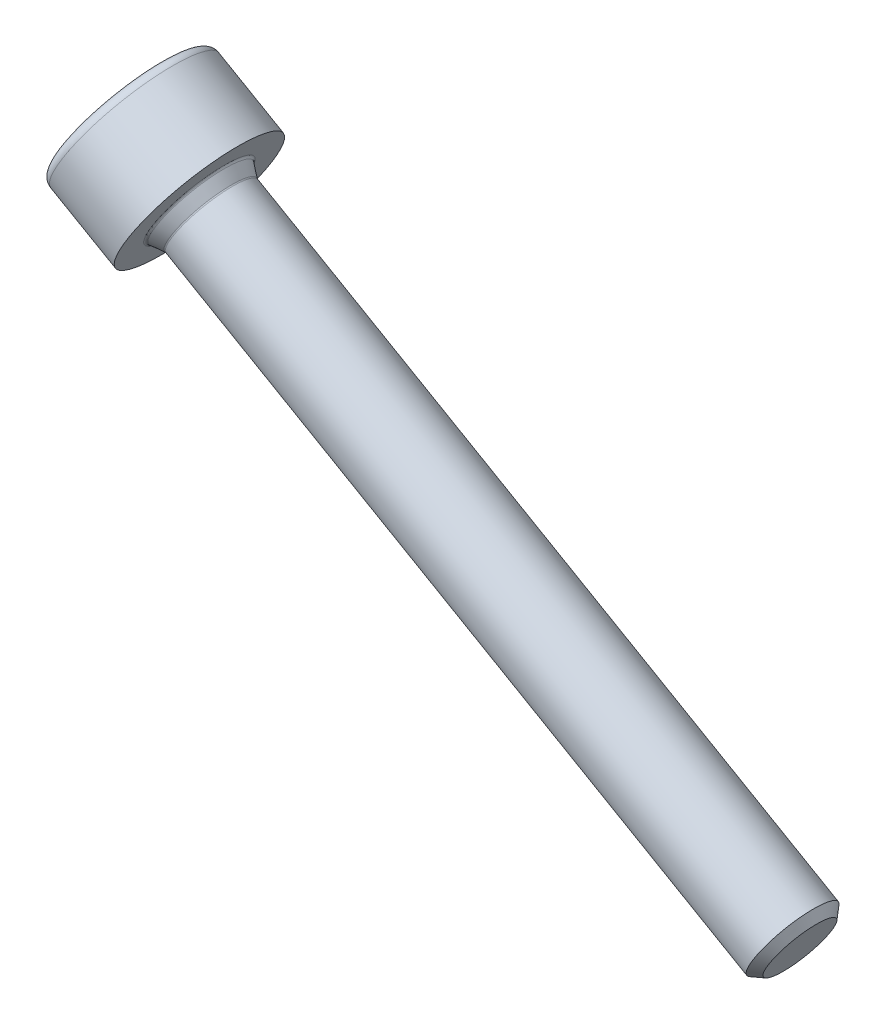
ISO-10303-21;
HEADER;
FILE_DESCRIPTION(('STEP AP214'),'2;1');
FILE_NAME('part.step','',(''),(''),'','','');
FILE_SCHEMA(('AUTOMOTIVE_DESIGN { 1 0 10303 214 1 1 1 1 }'));
ENDSEC;
DATA;
#1=APPLICATION_CONTEXT('core data for automotive mechanical design processes');
#2=APPLICATION_PROTOCOL_DEFINITION('international standard','automotive_design',2000,#1);
#3=PRODUCT_CONTEXT('',#1,'mechanical');
#4=PRODUCT('Part','Part','',(#3));
#5=PRODUCT_RELATED_PRODUCT_CATEGORY('part','',(#4));
#6=PRODUCT_DEFINITION_FORMATION('','',#4);
#7=PRODUCT_DEFINITION_CONTEXT('part definition',#1,'design');
#8=PRODUCT_DEFINITION('design','',#6,#7);
#9=PRODUCT_DEFINITION_SHAPE('','',#8);
#10=(LENGTH_UNIT() NAMED_UNIT(*) SI_UNIT(.MILLI.,.METRE.));
#11=(NAMED_UNIT(*) PLANE_ANGLE_UNIT() SI_UNIT($,.RADIAN.));
#12=(NAMED_UNIT(*) SI_UNIT($,.STERADIAN.) SOLID_ANGLE_UNIT());
#13=UNCERTAINTY_MEASURE_WITH_UNIT(LENGTH_MEASURE(1.E-05),#10,'distance_accuracy_value','');
#14=(GEOMETRIC_REPRESENTATION_CONTEXT(3) GLOBAL_UNCERTAINTY_ASSIGNED_CONTEXT((#13)) GLOBAL_UNIT_ASSIGNED_CONTEXT((#10,
#11,#12)) REPRESENTATION_CONTEXT('',''));
#15=CARTESIAN_POINT('',(0.,0.,0.));
#16=DIRECTION('',(0.,0.,1.));
#17=DIRECTION('',(1.,0.,0.));
#18=AXIS2_PLACEMENT_3D('',#15,#16,#17);
#19=CARTESIAN_POINT('',(124.013689728883,914.430023730724,-371.357743681072));
#20=DIRECTION('',(0.866025403784438,-0.5,0.));
#21=DIRECTION('',(0.5,0.866025403784438,0.));
#22=AXIS2_PLACEMENT_3D('',#19,#20,#21);
#23=PLANE('',#22);
#24=DIRECTION('',(-0.433012701892355,-0.749999999999922,-0.499999999999999));
#25=VECTOR('',#24,1.);
#26=CARTESIAN_POINT('',(124.326189728883,914.971289608089,-372.440275435803));
#27=LINE('',#26,#25);
#28=CARTESIAN_POINT('',(124.326189728507,914.97128960818,-372.440275435613));
#29=VERTEX_POINT('',#28);
#30=CARTESIAN_POINT('',(124.013689728883,914.430023730724,-372.801119354046));
#31=VERTEX_POINT('',#30);
#32=EDGE_CURVE('E164',#29,#31,#27,.T.);
#33=ORIENTED_EDGE('',*,*,#32,.T.);
#34=DIRECTION('',(-0.433012701891765,-0.750000000000276,0.499999999999979));
#35=VECTOR('',#34,1.);
#36=CARTESIAN_POINT('',(124.013689728883,914.430023730724,-372.801119354046));
#37=LINE('',#36,#35);
#38=CARTESIAN_POINT('',(123.701189728616,913.888757853638,-372.440275435613));
#39=VERTEX_POINT('',#38);
#40=EDGE_CURVE('E160',#31,#39,#37,.T.);
#41=ORIENTED_EDGE('',*,*,#40,.T.);
#42=CARTESIAN_POINT('',(124.01368972824,914.430023731095,-371.357743681072));
#43=DIRECTION('',(-0.866025403784524,0.499999999999852,-1.07369896469085E-13));
#44=DIRECTION('',(-0.499999999999852,-0.866025403784524,0.));
#45=AXIS2_PLACEMENT_3D('',#42,#43,#44);
#46=CIRCLE('',#45,1.24999999956268);
#47=EDGE_CURVE('E161',#39,#29,#46,.F.);
#48=ORIENTED_EDGE('',*,*,#47,.T.);
#49=EDGE_LOOP('',(#33,#41,#48));
#50=FACE_BOUND('',#49,.T.);
#51=ADVANCED_FACE('F17',(#50),#23,.F.);
#52=CARTESIAN_POINT('',(124.013689728883,914.430023730724,-371.357743681072));
#53=DIRECTION('',(0.866025403784438,-0.5,0.));
#54=DIRECTION('',(0.5,0.866025403784438,0.));
#55=AXIS2_PLACEMENT_3D('',#52,#53,#54);
#56=PLANE('',#55);
#57=DIRECTION('',(0.,0.,1.));
#58=VECTOR('',#57,1.);
#59=CARTESIAN_POINT('',(124.638689728883,915.512555485454,-372.079431517559));
#60=LINE('',#59,#58);
#61=CARTESIAN_POINT('',(124.638689728452,915.51255548545,-371.357743681072));
#62=VERTEX_POINT('',#61);
#63=CARTESIAN_POINT('',(124.638689728883,915.512555485454,-372.079431517559));
#64=VERTEX_POINT('',#63);
#65=EDGE_CURVE('E524',#62,#64,#60,.F.);
#66=ORIENTED_EDGE('',*,*,#65,.T.);
#67=DIRECTION('',(-0.43301270189244,-0.749999999999876,-0.499999999999994));
#68=VECTOR('',#67,1.);
#69=CARTESIAN_POINT('',(124.638689728883,915.512555485454,-372.079431517559));
#70=LINE('',#69,#68);
#71=EDGE_CURVE('E552',#64,#29,#70,.T.);
#72=ORIENTED_EDGE('',*,*,#71,.T.);
#73=CARTESIAN_POINT('',(124.01368972824,914.430023731095,-371.357743681072));
#74=DIRECTION('',(-0.866025403784524,0.499999999999852,-1.07369896469085E-13));
#75=DIRECTION('',(-0.499999999999852,-0.866025403784524,0.));
#76=AXIS2_PLACEMENT_3D('',#73,#74,#75);
#77=CIRCLE('',#76,1.24999999956267);
#78=EDGE_CURVE('E179',#62,#29,#77,.T.);
#79=ORIENTED_EDGE('',*,*,#78,.F.);
#80=EDGE_LOOP('',(#66,#72,#79));
#81=FACE_BOUND('',#80,.T.);
#82=ADVANCED_FACE('F756',(#81),#56,.F.);
#83=CARTESIAN_POINT('',(124.013689728883,914.430023730724,-372.801119354046));
#84=DIRECTION('',(0.250000000000001,0.433012701892219,-0.866025403784438));
#85=DIRECTION('',(0.,0.894427190999916,0.447213595499958));
#86=AXIS2_PLACEMENT_3D('',#83,#84,#85);
#87=PLANE('',#86);
#88=DIRECTION('',(0.433012701867895,0.750000000013765,0.500000000000418));
#89=VECTOR('',#88,1.);
#90=CARTESIAN_POINT('',(122.411542731882,915.355023730723,-372.801119354046));
#91=LINE('',#90,#89);
#92=CARTESIAN_POINT('',(122.411542731882,915.355023730723,-372.801119354046));
#93=VERTEX_POINT('',#92);
#94=CARTESIAN_POINT('',(122.41886092138,915.367699206754,-372.792669036692));
#95=VERTEX_POINT('',#94);
#96=EDGE_CURVE('E428',#93,#95,#91,.T.);
#97=ORIENTED_EDGE('',*,*,#96,.F.);
#98=DIRECTION('',(0.866025403784591,-0.499999999999736,-1.80036166155496E-13));
#99=VECTOR('',#98,1.);
#100=CARTESIAN_POINT('',(122.411542731882,915.355023730723,-372.801119354046));
#101=LINE('',#100,#99);
#102=EDGE_CURVE('E169',#93,#31,#101,.T.);
#103=ORIENTED_EDGE('',*,*,#102,.T.);
#104=ORIENTED_EDGE('',*,*,#32,.F.);
#105=ORIENTED_EDGE('',*,*,#71,.F.);
#106=DIRECTION('',(-0.866025403784438,0.5,0.));
#107=VECTOR('',#106,1.);
#108=CARTESIAN_POINT('',(124.638689728883,915.512555485454,-372.079431517559));
#109=LINE('',#108,#107);
#110=CARTESIAN_POINT('',(123.036542731882,916.437555485454,-372.079431517559));
#111=VERTEX_POINT('',#110);
#112=EDGE_CURVE('E514',#64,#111,#109,.T.);
#113=ORIENTED_EDGE('',*,*,#112,.T.);
#114=DIRECTION('',(0.433012701911929,0.749999999989595,0.499999999998538));
#115=VECTOR('',#114,1.);
#116=CARTESIAN_POINT('',(123.029224542447,916.424880009534,-372.087881834839));
#117=LINE('',#116,#115);
#118=CARTESIAN_POINT('',(123.02922454233,916.424880009575,-372.087881834832));
#119=VERTEX_POINT('',#118);
#120=EDGE_CURVE('E182',#119,#111,#117,.T.);
#121=ORIENTED_EDGE('',*,*,#120,.F.);
#122=CARTESIAN_POINT('',(122.418860921245,915.367699206742,-372.792669036763));
#123=CARTESIAN_POINT('',(122.460323252377,915.392084500179,-372.768507246008));
#124=CARTESIAN_POINT('',(122.500895838418,915.417776914512,-372.743948742099));
#125=CARTESIAN_POINT('',(122.579570026428,915.472471904307,-372.693889965383));
#126=CARTESIAN_POINT('',(122.617655236305,915.501493522869,-372.668384903017));
#127=CARTESIAN_POINT('',(122.690002590108,915.563144331405,-372.616674616654));
#128=CARTESIAN_POINT('',(122.724278687435,915.595759419857,-372.590472415418));
#129=CARTESIAN_POINT('',(122.787934622118,915.664914165601,-372.537519157033));
#130=CARTESIAN_POINT('',(122.817328605914,915.701441960918,-372.510769947146));
#131=CARTESIAN_POINT('',(122.850994132117,915.750237459471,-372.476653797562));
#132=CARTESIAN_POINT('',(122.857950694537,915.760765205977,-372.469381737716));
#133=CARTESIAN_POINT('',(122.871430656594,915.782082152574,-372.454831934556));
#134=CARTESIAN_POINT('',(122.877954251415,915.79287123182,-372.44755419532));
#135=CARTESIAN_POINT('',(122.900683906372,915.832243566087,-372.421306541983));
#136=CARTESIAN_POINT('',(122.915613423723,915.861575651459,-372.402330718866));
#137=CARTESIAN_POINT('',(122.942425456198,915.921702869726,-372.364527142649));
#138=CARTESIAN_POINT('',(122.954305815038,915.952499019829,-372.34569950341));
#139=CARTESIAN_POINT('',(122.985620957973,916.046867321008,-372.289475449719));
#140=CARTESIAN_POINT('',(123.000602440361,916.112192259951,-372.252488198803));
#141=CARTESIAN_POINT('',(123.017037805398,916.219190365887,-372.194244664621));
#142=CARTESIAN_POINT('',(123.021485465409,916.260199858814,-372.172455989305));
#143=CARTESIAN_POINT('',(123.027396899841,916.342392598416,-372.129653135374));
#144=CARTESIAN_POINT('',(123.028885957694,916.383571332561,-372.108633914325));
#145=CARTESIAN_POINT('',(123.029224542321,916.424880009559,-372.087881834863));
#146=B_SPLINE_CURVE_WITH_KNOTS('',3,(#122,#123,#124,#125,#126,#127,#128,#129,#130,#131,#132,
#133,#134,#135,#136,#137,#138,#139,#140,#141,#142,#143,#144,#145),.UNSPECIFIED.,.F.,.F.,(4,2,2,
2,2,2,2,2,2,2,2,4),(0.,0.161592976183378,0.324161275150696,0.486112932455312,0.647586806181404,
0.691272786543416,0.734938937489955,0.848735605573052,0.962612527277263,1.19125625187376,
1.33113310610196,1.46980937847544),.UNSPECIFIED.);
#147=EDGE_CURVE('E423',#95,#119,#146,.T.);
#148=ORIENTED_EDGE('',*,*,#147,.F.);
#149=EDGE_LOOP('',(#97,#103,#104,#105,#113,#121,#148));
#150=FACE_BOUND('',#149,.T.);
#151=ADVANCED_FACE('F414',(#150),#87,.F.);
#152=CARTESIAN_POINT('',(123.388689728883,913.347491975993,-372.079431517559));
#153=DIRECTION('',(-0.25,-0.433012701892219,-0.866025403784439));
#154=DIRECTION('',(0.,0.894427190999916,-0.447213595499957));
#155=AXIS2_PLACEMENT_3D('',#152,#153,#154);
#156=PLANE('',#155);
#157=DIRECTION('',(0.866025403784438,-0.5,0.));
#158=VECTOR('',#157,1.);
#159=CARTESIAN_POINT('',(123.388689728883,913.347491975993,-372.079431517559));
#160=LINE('',#159,#158);
#161=CARTESIAN_POINT('',(121.786542731882,914.272491975993,-372.079431517559));
#162=VERTEX_POINT('',#161);
#163=CARTESIAN_POINT('',(123.388689728883,913.347491975993,-372.079431517559));
#164=VERTEX_POINT('',#163);
#165=EDGE_CURVE('E174',#162,#164,#160,.T.);
#166=ORIENTED_EDGE('',*,*,#165,.T.);
#167=DIRECTION('',(0.433012701892023,0.749999999999688,-0.500000000000638));
#168=VECTOR('',#167,1.);
#169=CARTESIAN_POINT('',(123.388689728883,913.347491975993,-372.079431517559));
#170=LINE('',#169,#168);
#171=EDGE_CURVE('E148',#164,#39,#170,.T.);
#172=ORIENTED_EDGE('',*,*,#171,.T.);
#173=ORIENTED_EDGE('',*,*,#40,.F.);
#174=ORIENTED_EDGE('',*,*,#102,.F.);
#175=DIRECTION('',(0.433012701940646,0.749999999972559,-0.499999999999223));
#176=VECTOR('',#175,1.);
#177=CARTESIAN_POINT('',(122.404224542447,915.342348254804,-372.792669036766));
#178=LINE('',#177,#176);
#179=CARTESIAN_POINT('',(122.404224542303,915.342348254798,-372.792669036742));
#180=VERTEX_POINT('',#179);
#181=EDGE_CURVE('E422',#180,#93,#178,.T.);
#182=ORIENTED_EDGE('',*,*,#181,.F.);
#183=CARTESIAN_POINT('',(121.793860921234,914.285167451992,-372.087881834881));
#184=CARTESIAN_POINT('',(121.835323252375,914.309552745441,-372.112043625612));
#185=CARTESIAN_POINT('',(121.875895838419,914.33524515978,-372.136602129512));
#186=CARTESIAN_POINT('',(121.954570026433,914.38994014958,-372.18666090622));
#187=CARTESIAN_POINT('',(121.992655236309,914.418961768141,-372.212165968589));
#188=CARTESIAN_POINT('',(122.065002590111,914.480612576676,-372.263876254955));
#189=CARTESIAN_POINT('',(122.099278687437,914.513227665127,-372.29007845619));
#190=CARTESIAN_POINT('',(122.16293462212,914.582382410872,-372.343031714572));
#191=CARTESIAN_POINT('',(122.192328605914,914.618910206189,-372.369780924457));
#192=CARTESIAN_POINT('',(122.225994132118,914.667705704739,-372.403897074044));
#193=CARTESIAN_POINT('',(122.232950694537,914.678233451244,-372.411169133891));
#194=CARTESIAN_POINT('',(122.246430656594,914.699550397844,-372.425718937047));
#195=CARTESIAN_POINT('',(122.252954251415,914.710339477094,-372.432996676279));
#196=CARTESIAN_POINT('',(122.275683906371,914.749711811368,-372.459244329609));
#197=CARTESIAN_POINT('',(122.290613423723,914.779043896732,-372.478220152736));
#198=CARTESIAN_POINT('',(122.317425456199,914.839171114994,-372.516023728961));
#199=CARTESIAN_POINT('',(122.329305815039,914.869967265098,-372.534851368197));
#200=CARTESIAN_POINT('',(122.360620957973,914.96433556628,-372.591075421884));
#201=CARTESIAN_POINT('',(122.375602440361,915.029660505221,-372.628062672802));
#202=CARTESIAN_POINT('',(122.392037805399,915.136658611156,-372.686306206985));
#203=CARTESIAN_POINT('',(122.396485465409,915.177668104083,-372.708094882301));
#204=CARTESIAN_POINT('',(122.402396899841,915.259860843685,-372.750897736231));
#205=CARTESIAN_POINT('',(122.403885957694,915.301039577831,-372.77191695728));
#206=CARTESIAN_POINT('',(122.404224542321,915.342348254828,-372.792669036742));
#207=B_SPLINE_CURVE_WITH_KNOTS('',3,(#183,#184,#185,#186,#187,#188,#189,#190,#191,#192,#193,
#194,#195,#196,#197,#198,#199,#200,#201,#202,#203,#204,#205,#206),.UNSPECIFIED.,.F.,.F.,(4,2,2,
2,2,2,2,2,2,2,2,4),(0.,0.161592976186598,0.324161275155928,0.486112932457771,0.647586806181513,
0.691272786543545,0.734938937490575,0.848735605574418,0.962612527278561,1.19125625187384,
1.33113310610182,1.46980937847617),.UNSPECIFIED.);
#208=CARTESIAN_POINT('',(121.79386092138,914.285167452023,-372.087881834912));
#209=VERTEX_POINT('',#208);
#210=EDGE_CURVE('E417',#209,#180,#207,.T.);
#211=ORIENTED_EDGE('',*,*,#210,.F.);
#212=DIRECTION('',(0.433012701871407,0.750000000011856,-0.50000000000024));
#213=VECTOR('',#212,1.);
#214=CARTESIAN_POINT('',(121.786542731882,914.272491975993,-372.079431517559));
#215=LINE('',#214,#213);
#216=EDGE_CURVE('E168',#162,#209,#215,.T.);
#217=ORIENTED_EDGE('',*,*,#216,.F.);
#218=EDGE_LOOP('',(#166,#172,#173,#174,#182,#211,#217));
#219=FACE_BOUND('',#218,.T.);
#220=ADVANCED_FACE('F171',(#219),#156,.F.);
#221=CARTESIAN_POINT('',(124.013689728883,914.430023730724,-371.357743681072));
#222=DIRECTION('',(0.866025403784438,-0.5,0.));
#223=DIRECTION('',(0.5,0.866025403784438,0.));
#224=AXIS2_PLACEMENT_3D('',#221,#222,#223);
#225=PLANE('',#224);
#226=ORIENTED_EDGE('',*,*,#171,.F.);
#227=DIRECTION('',(0.,0.,1.));
#228=VECTOR('',#227,1.);
#229=CARTESIAN_POINT('',(123.388689728883,913.347491975993,-370.636055844585));
#230=LINE('',#229,#228);
#231=CARTESIAN_POINT('',(123.388689728671,913.347491976368,-371.357743681072));
#232=VERTEX_POINT('',#231);
#233=EDGE_CURVE('E150',#164,#232,#230,.T.);
#234=ORIENTED_EDGE('',*,*,#233,.T.);
#235=CARTESIAN_POINT('',(124.01368972824,914.430023731095,-371.357743681072));
#236=DIRECTION('',(-0.866025403784524,0.499999999999852,-1.07369896469085E-13));
#237=DIRECTION('',(-0.499999999999852,-0.866025403784524,0.));
#238=AXIS2_PLACEMENT_3D('',#235,#236,#237);
#239=CIRCLE('',#238,1.24999999956264);
#240=EDGE_CURVE('E144',#232,#39,#239,.F.);
#241=ORIENTED_EDGE('',*,*,#240,.T.);
#242=EDGE_LOOP('',(#226,#234,#241));
#243=FACE_BOUND('',#242,.T.);
#244=ADVANCED_FACE('F146',(#243),#225,.F.);
#245=CARTESIAN_POINT('',(124.01368972824,914.430023731095,-371.357743681072));
#246=DIRECTION('',(-0.866025403784524,0.499999999999852,-1.07369896469085E-13));
#247=DIRECTION('',(-0.499999999999852,-0.866025403784524,0.));
#248=AXIS2_PLACEMENT_3D('',#245,#246,#247);
#249=CONICAL_SURFACE('',#248,1.24999999956264,1.04719754984257);
#250=CARTESIAN_POINT('',(124.01368972824,914.430023731095,-371.357743681072));
#251=DIRECTION('',(-0.866025403784524,0.499999999999852,-1.07369896469085E-13));
#252=DIRECTION('',(-0.499999999999852,-0.866025403784524,0.));
#253=AXIS2_PLACEMENT_3D('',#250,#251,#252);
#254=CIRCLE('',#253,1.24999999956263);
#255=CARTESIAN_POINT('',(124.326189728507,914.97128960818,-370.275211926531));
#256=VERTEX_POINT('',#255);
#257=EDGE_CURVE('E155',#256,#62,#254,.T.);
#258=ORIENTED_EDGE('',*,*,#257,.T.);
#259=ORIENTED_EDGE('',*,*,#78,.T.);
#260=ORIENTED_EDGE('',*,*,#47,.F.);
#261=ORIENTED_EDGE('',*,*,#240,.F.);
#262=CARTESIAN_POINT('',(124.01368972824,914.430023731095,-371.357743681072));
#263=DIRECTION('',(-0.866025403784524,0.499999999999852,-1.07369896469085E-13));
#264=DIRECTION('',(-0.499999999999852,-0.866025403784524,0.));
#265=AXIS2_PLACEMENT_3D('',#262,#263,#264);
#266=CIRCLE('',#265,1.24999999956266);
#267=CARTESIAN_POINT('',(123.701189728616,913.888757853638,-370.275211926531));
#268=VERTEX_POINT('',#267);
#269=EDGE_CURVE('E382',#232,#268,#266,.T.);
#270=ORIENTED_EDGE('',*,*,#269,.T.);
#271=CARTESIAN_POINT('',(124.01368972824,914.430023731095,-371.357743681072));
#272=DIRECTION('',(-0.866025403784524,0.499999999999852,-1.07369896469085E-13));
#273=DIRECTION('',(-0.499999999999852,-0.866025403784524,0.));
#274=AXIS2_PLACEMENT_3D('',#271,#272,#273);
#275=CIRCLE('',#274,1.24999999956268);
#276=EDGE_CURVE('E793',#268,#256,#275,.T.);
#277=ORIENTED_EDGE('',*,*,#276,.T.);
#278=EDGE_LOOP('',(#258,#259,#260,#261,#270,#277));
#279=FACE_BOUND('',#278,.T.);
#280=CARTESIAN_POINT('',(124.638689729813,914.069179811889,-371.3577436811));
#281=VERTEX_POINT('',#280);
#282=VERTEX_LOOP('',#281);
#283=FACE_BOUND('',#282,.T.);
#284=ADVANCED_FACE('F176',(#279,#283),#249,.F.);
#285=CARTESIAN_POINT('',(124.013689728883,914.430023730724,-371.357743681072));
#286=DIRECTION('',(0.866025403784438,-0.5,0.));
#287=DIRECTION('',(0.5,0.866025403784438,0.));
#288=AXIS2_PLACEMENT_3D('',#285,#286,#287);
#289=PLANE('',#288);
#290=DIRECTION('',(0.433012701892406,0.74999999999989,-0.500000000000003));
#291=VECTOR('',#290,1.);
#292=CARTESIAN_POINT('',(124.326189728883,914.971289608089,-370.275211926342));
#293=LINE('',#292,#291);
#294=CARTESIAN_POINT('',(124.638689728883,915.512555485454,-370.636055844585));
#295=VERTEX_POINT('',#294);
#296=EDGE_CURVE('E509',#256,#295,#293,.T.);
#297=ORIENTED_EDGE('',*,*,#296,.T.);
#298=DIRECTION('',(0.,0.,1.));
#299=VECTOR('',#298,1.);
#300=CARTESIAN_POINT('',(124.638689728883,915.512555485454,-372.079431517559));
#301=LINE('',#300,#299);
#302=EDGE_CURVE('E519',#295,#62,#301,.F.);
#303=ORIENTED_EDGE('',*,*,#302,.T.);
#304=ORIENTED_EDGE('',*,*,#257,.F.);
#305=EDGE_LOOP('',(#297,#303,#304));
#306=FACE_BOUND('',#305,.T.);
#307=ADVANCED_FACE('F402',(#306),#289,.F.);
#308=CARTESIAN_POINT('',(124.638689728883,915.512555485454,-372.079431517559));
#309=DIRECTION('',(0.5,0.866025403784438,0.));
#310=DIRECTION('',(-0.866025403784438,0.5,0.));
#311=AXIS2_PLACEMENT_3D('',#308,#309,#310);
#312=PLANE('',#311);
#313=ORIENTED_EDGE('',*,*,#112,.F.);
#314=ORIENTED_EDGE('',*,*,#65,.F.);
#315=ORIENTED_EDGE('',*,*,#302,.F.);
#316=DIRECTION('',(-0.866025403784398,0.500000000000071,0.));
#317=VECTOR('',#316,1.);
#318=CARTESIAN_POINT('',(124.638689728883,915.512555485454,-370.636055844585));
#319=LINE('',#318,#317);
#320=CARTESIAN_POINT('',(123.036542731882,916.437555485454,-370.636055844585));
#321=VERTEX_POINT('',#320);
#322=EDGE_CURVE('E505',#295,#321,#319,.T.);
#323=ORIENTED_EDGE('',*,*,#322,.T.);
#324=DIRECTION('',(0.,0.,1.));
#325=VECTOR('',#324,1.);
#326=CARTESIAN_POINT('',(123.036542731882,916.437555485454,-372.079431517559));
#327=LINE('',#326,#325);
#328=CARTESIAN_POINT('',(123.036542731776,916.437555485515,-370.652956479193));
#329=VERTEX_POINT('',#328);
#330=EDGE_CURVE('E517',#329,#321,#327,.T.);
#331=ORIENTED_EDGE('',*,*,#330,.F.);
#332=CARTESIAN_POINT('',(123.036542731797,916.437555485529,-372.062530882954));
#333=CARTESIAN_POINT('',(123.057080338342,916.425698092845,-372.014207301467));
#334=CARTESIAN_POINT('',(123.076384636121,916.414552751319,-371.965090293657));
#335=CARTESIAN_POINT('',(123.111706651816,916.394159576044,-371.864972740232));
#336=CARTESIAN_POINT('',(123.127703829757,916.384923601055,-371.813962615496));
#337=CARTESIAN_POINT('',(123.155268761932,916.369008980045,-371.710542042768));
#338=CARTESIAN_POINT('',(123.166853087354,916.362320766645,-371.658137640299));
#339=CARTESIAN_POINT('',(123.184650155061,916.352045624811,-371.55223112353));
#340=CARTESIAN_POINT('',(123.190878643562,916.348449605296,-371.498732703758));
#341=CARTESIAN_POINT('',(123.194998717549,916.346070879475,-371.43050040459));
#342=CARTESIAN_POINT('',(123.195657491405,916.345690536213,-371.415956284899));
#343=CARTESIAN_POINT('',(123.196536954303,916.345182778068,-371.386856678579));
#344=CARTESIAN_POINT('',(123.196757842059,916.345055248457,-371.372301200107));
#345=CARTESIAN_POINT('',(123.196756362427,916.345056102711,-371.319805893431));
#346=CARTESIAN_POINT('',(123.195252334912,916.345924453416,-371.281854247198));
#347=CARTESIAN_POINT('',(123.189325510037,916.349346307364,-371.206247094763));
#348=CARTESIAN_POINT('',(123.184900655001,916.351900998607,-371.168591816286));
#349=CARTESIAN_POINT('',(123.167524339131,916.361933219246,-371.056143708904));
#350=CARTESIAN_POINT('',(123.150473922611,916.371777281816,-370.982169207072));
#351=CARTESIAN_POINT('',(123.116468907442,916.391410086479,-370.865682138708));
#352=CARTESIAN_POINT('',(123.102047021114,916.399736566433,-370.822104788077));
#353=CARTESIAN_POINT('',(123.070890096687,916.417725025137,-370.736499080214));
#354=CARTESIAN_POINT('',(123.054175975144,916.427374927709,-370.694460638117));
#355=CARTESIAN_POINT('',(123.036542731776,916.437555485515,-370.652956479193));
#356=B_SPLINE_CURVE_WITH_KNOTS('',3,(#332,#333,#334,#335,#336,#337,#338,#339,#340,#341,#342,
#343,#344,#345,#346,#347,#348,#349,#350,#351,#352,#353,#354,#355),.UNSPECIFIED.,.F.,.F.,(4,2,2,
2,2,2,2,2,2,2,2,4),(0.,0.161592976186531,0.324161275155863,0.486112932457611,0.647586806181321,
0.691272786543146,0.734938937489721,0.848735605573516,0.962612527277598,1.1912562518729,
1.33113310610037,1.46980937847467),.UNSPECIFIED.);
#357=CARTESIAN_POINT('',(123.036542731828,916.437555485485,-372.062530882828));
#358=VERTEX_POINT('',#357);
#359=EDGE_CURVE('E383',#358,#329,#356,.T.);
#360=ORIENTED_EDGE('',*,*,#359,.F.);
#361=DIRECTION('',(0.,0.,1.));
#362=VECTOR('',#361,1.);
#363=CARTESIAN_POINT('',(123.036542731882,916.437555485454,-372.079431517559));
#364=LINE('',#363,#362);
#365=EDGE_CURVE('E381',#111,#358,#364,.T.);
#366=ORIENTED_EDGE('',*,*,#365,.F.);
#367=EDGE_LOOP('',(#313,#314,#315,#323,#331,#360,#366));
#368=FACE_BOUND('',#367,.T.);
#369=ADVANCED_FACE('F396',(#368),#312,.F.);
#370=CARTESIAN_POINT('',(123.388689728883,913.347491975993,-370.636055844585));
#371=DIRECTION('',(-0.5,-0.866025403784438,0.));
#372=DIRECTION('',(0.866025403784438,-0.5,0.));
#373=AXIS2_PLACEMENT_3D('',#370,#371,#372);
#374=PLANE('',#373);
#375=DIRECTION('',(0.866025403784396,-0.500000000000074,0.));
#376=VECTOR('',#375,1.);
#377=CARTESIAN_POINT('',(121.786542731882,914.272491975993,-370.636055844585));
#378=LINE('',#377,#376);
#379=CARTESIAN_POINT('',(121.786542731882,914.272491975993,-370.636055844585));
#380=VERTEX_POINT('',#379);
#381=CARTESIAN_POINT('',(123.388689728883,913.347491975993,-370.636055844585));
#382=VERTEX_POINT('',#381);
#383=EDGE_CURVE('E802',#380,#382,#378,.T.);
#384=ORIENTED_EDGE('',*,*,#383,.T.);
#385=DIRECTION('',(0.,0.,1.));
#386=VECTOR('',#385,1.);
#387=CARTESIAN_POINT('',(123.388689728883,913.347491975993,-371.357743681072));
#388=LINE('',#387,#386);
#389=EDGE_CURVE('E823',#382,#232,#388,.F.);
#390=ORIENTED_EDGE('',*,*,#389,.T.);
#391=ORIENTED_EDGE('',*,*,#233,.F.);
#392=ORIENTED_EDGE('',*,*,#165,.F.);
#393=DIRECTION('',(0.,0.,1.));
#394=VECTOR('',#393,1.);
#395=CARTESIAN_POINT('',(121.786542731882,914.272491975993,-370.636055844585));
#396=LINE('',#395,#394);
#397=CARTESIAN_POINT('',(121.786542731776,914.272491976054,-372.062530882952));
#398=VERTEX_POINT('',#397);
#399=EDGE_CURVE('E380',#398,#162,#396,.F.);
#400=ORIENTED_EDGE('',*,*,#399,.F.);
#401=CARTESIAN_POINT('',(121.786542731775,914.272491976029,-370.65295647919));
#402=CARTESIAN_POINT('',(121.807080338334,914.26063458337,-370.701280060676));
#403=CARTESIAN_POINT('',(121.82638463612,914.249489241853,-370.750397068486));
#404=CARTESIAN_POINT('',(121.861706651819,914.229096066587,-370.850514621911));
#405=CARTESIAN_POINT('',(121.877703829759,914.219860091595,-370.901524746648));
#406=CARTESIAN_POINT('',(121.905268761932,914.203945470582,-371.004945319375));
#407=CARTESIAN_POINT('',(121.916853087354,914.197257257182,-371.057349721845));
#408=CARTESIAN_POINT('',(121.934650155063,914.186982115351,-371.163256238614));
#409=CARTESIAN_POINT('',(121.940878643566,914.18338609584,-371.216754658386));
#410=CARTESIAN_POINT('',(121.94499871755,914.181007370012,-371.284986957554));
#411=CARTESIAN_POINT('',(121.945657491404,914.180627026748,-371.299531077245));
#412=CARTESIAN_POINT('',(121.946536954306,914.18011926861,-371.328630683565));
#413=CARTESIAN_POINT('',(121.946757842067,914.179991739008,-371.343186162037));
#414=CARTESIAN_POINT('',(121.946756362445,914.179992593279,-371.395681468713));
#415=CARTESIAN_POINT('',(121.945252334918,914.180860943963,-371.433633114946));
#416=CARTESIAN_POINT('',(121.939325510033,914.184282797894,-371.509240267381));
#417=CARTESIAN_POINT('',(121.934900655,914.186837489143,-371.546895545858));
#418=CARTESIAN_POINT('',(121.917524339135,914.19686970979,-371.65934365324));
#419=CARTESIAN_POINT('',(121.900473922613,914.206713772356,-371.733318155072));
#420=CARTESIAN_POINT('',(121.866468907443,914.226346577017,-371.849805223436));
#421=CARTESIAN_POINT('',(121.852047021115,914.234673056971,-371.893382574067));
#422=CARTESIAN_POINT('',(121.820890096688,914.252661515676,-371.97898828193));
#423=CARTESIAN_POINT('',(121.804175975145,914.262311418249,-372.021026724028));
#424=CARTESIAN_POINT('',(121.786542731777,914.272491976054,-372.062530882951));
#425=B_SPLINE_CURVE_WITH_KNOTS('',3,(#401,#402,#403,#404,#405,#406,#407,#408,#409,#410,#411,
#412,#413,#414,#415,#416,#417,#418,#419,#420,#421,#422,#423,#424),.UNSPECIFIED.,.F.,.F.,(4,2,2,
2,2,2,2,2,2,2,2,4),(0.,0.161592976186664,0.324161275156032,0.48611293245778,0.64758680618156,
0.691272786543495,0.734938937490181,0.848735605573976,0.962612527278,1.19125625187322,
1.33113310610119,1.46980937847566),.UNSPECIFIED.);
#426=CARTESIAN_POINT('',(121.786542731829,914.272491976024,-370.652956479315));
#427=VERTEX_POINT('',#426);
#428=EDGE_CURVE('E372',#427,#398,#425,.T.);
#429=ORIENTED_EDGE('',*,*,#428,.F.);
#430=DIRECTION('',(0.,0.,1.));
#431=VECTOR('',#430,1.);
#432=CARTESIAN_POINT('',(121.786542731882,914.272491975993,-370.636055844585));
#433=LINE('',#432,#431);
#434=EDGE_CURVE('E496',#380,#427,#433,.F.);
#435=ORIENTED_EDGE('',*,*,#434,.F.);
#436=EDGE_LOOP('',(#384,#390,#391,#392,#400,#429,#435));
#437=FACE_BOUND('',#436,.T.);
#438=ADVANCED_FACE('F391',(#437),#374,.F.);
#439=CARTESIAN_POINT('',(124.013689728883,914.430023730724,-371.357743681072));
#440=DIRECTION('',(0.866025403784438,-0.5,0.));
#441=DIRECTION('',(0.5,0.866025403784438,0.));
#442=AXIS2_PLACEMENT_3D('',#439,#440,#441);
#443=PLANE('',#442);
#444=ORIENTED_EDGE('',*,*,#389,.F.);
#445=DIRECTION('',(0.43301270189234,0.749999999999928,0.500000000000003));
#446=VECTOR('',#445,1.);
#447=CARTESIAN_POINT('',(123.388689728883,913.347491975993,-370.636055844585));
#448=LINE('',#447,#446);
#449=EDGE_CURVE('E816',#382,#268,#448,.T.);
#450=ORIENTED_EDGE('',*,*,#449,.T.);
#451=ORIENTED_EDGE('',*,*,#269,.F.);
#452=EDGE_LOOP('',(#444,#450,#451));
#453=FACE_BOUND('',#452,.T.);
#454=ADVANCED_FACE('F395',(#453),#443,.F.);
#455=CARTESIAN_POINT('',(124.013689728883,914.430023730724,-371.357743681072));
#456=DIRECTION('',(0.866025403784438,-0.5,0.));
#457=DIRECTION('',(0.5,0.866025403784438,0.));
#458=AXIS2_PLACEMENT_3D('',#455,#456,#457);
#459=PLANE('',#458);
#460=DIRECTION('',(0.433012701891799,0.750000000000263,0.49999999999997));
#461=VECTOR('',#460,1.);
#462=CARTESIAN_POINT('',(123.701189728883,913.888757853358,-370.275211926342));
#463=LINE('',#462,#461);
#464=CARTESIAN_POINT('',(124.013689728883,914.430023730724,-369.914368008098));
#465=VERTEX_POINT('',#464);
#466=EDGE_CURVE('E339',#268,#465,#463,.T.);
#467=ORIENTED_EDGE('',*,*,#466,.T.);
#468=DIRECTION('',(0.433012701892389,0.749999999999909,-0.49999999999999));
#469=VECTOR('',#468,1.);
#470=CARTESIAN_POINT('',(124.013689728883,914.430023730724,-369.914368008098));
#471=LINE('',#470,#469);
#472=EDGE_CURVE('E528',#465,#256,#471,.T.);
#473=ORIENTED_EDGE('',*,*,#472,.T.);
#474=ORIENTED_EDGE('',*,*,#276,.F.);
#475=EDGE_LOOP('',(#467,#473,#474));
#476=FACE_BOUND('',#475,.T.);
#477=ADVANCED_FACE('F704',(#476),#459,.F.);
#478=CARTESIAN_POINT('',(124.638689728883,915.512555485454,-370.636055844585));
#479=DIRECTION('',(0.25,0.433012701892219,0.866025403784439));
#480=DIRECTION('',(0.,-0.894427190999916,0.447213595499957));
#481=AXIS2_PLACEMENT_3D('',#478,#479,#480);
#482=PLANE('',#481);
#483=ORIENTED_EDGE('',*,*,#322,.F.);
#484=ORIENTED_EDGE('',*,*,#296,.F.);
#485=ORIENTED_EDGE('',*,*,#472,.F.);
#486=DIRECTION('',(-0.866025403784589,0.49999999999974,-1.80036166155497E-13));
#487=VECTOR('',#486,1.);
#488=CARTESIAN_POINT('',(124.013689728883,914.430023730724,-369.914368008098));
#489=LINE('',#488,#487);
#490=CARTESIAN_POINT('',(122.411542731882,915.355023730723,-369.914368008098));
#491=VERTEX_POINT('',#490);
#492=EDGE_CURVE('E333',#465,#491,#489,.T.);
#493=ORIENTED_EDGE('',*,*,#492,.T.);
#494=DIRECTION('',(-0.43301270187074,-0.750000000012123,0.500000000000418));
#495=VECTOR('',#494,1.);
#496=CARTESIAN_POINT('',(122.418860921316,915.367699206643,-369.922818325378));
#497=LINE('',#496,#495);
#498=CARTESIAN_POINT('',(122.418860921213,915.367699206709,-369.922818325401));
#499=VERTEX_POINT('',#498);
#500=EDGE_CURVE('E808',#499,#491,#497,.T.);
#501=ORIENTED_EDGE('',*,*,#500,.F.);
#502=CARTESIAN_POINT('',(123.029224542337,916.424880009566,-370.627605527263));
#503=CARTESIAN_POINT('',(123.028837424301,916.376779930773,-370.603443736532));
#504=CARTESIAN_POINT('',(123.026873433821,916.328796833392,-370.578885232632));
#505=CARTESIAN_POINT('',(123.018843277202,916.23331549305,-370.528826455924));
#506=CARTESIAN_POINT('',(123.012752423207,916.185821924508,-370.503321393554));
#507=CARTESIAN_POINT('',(122.995534933753,916.092341873952,-370.451611107189));
#508=CARTESIAN_POINT('',(122.984427487271,916.046350358699,-370.425408905954));
#509=CARTESIAN_POINT('',(122.956365688005,915.95664532929,-370.372455647571));
#510=CARTESIAN_POINT('',(122.939428681213,915.912925494947,-370.345706437687));
#511=CARTESIAN_POINT('',(122.914003302981,915.859372544748,-370.3115902881));
#512=CARTESIAN_POINT('',(122.908364288272,915.848084111717,-370.304318228253));
#513=CARTESIAN_POINT('',(122.896643252014,915.825751648834,-370.289768425097));
#514=CARTESIAN_POINT('',(122.890561432711,915.814707510371,-370.282490685865));
#515=CARTESIAN_POINT('',(122.867828818502,915.775336884623,-370.256243032536));
#516=CARTESIAN_POINT('',(122.849891246107,915.747741500648,-370.237267209409));
#517=CARTESIAN_POINT('',(122.811225563871,915.694457990266,-370.199463633183));
#518=CARTESIAN_POINT('',(122.790495494962,915.668771222652,-370.180635993947));
#519=CARTESIAN_POINT('',(122.724427720294,915.594467362757,-370.124411940261));
#520=CARTESIAN_POINT('',(122.675345404864,915.548830548952,-370.087424689343));
#521=CARTESIAN_POINT('',(122.590900009487,915.481098052341,-370.029181155159));
#522=CARTESIAN_POINT('',(122.557608576821,915.456741519321,-370.007392479844));
#523=CARTESIAN_POINT('',(122.489383293534,915.410525697129,-369.964589625913));
#524=CARTESIAN_POINT('',(122.454465992595,915.388646768128,-369.943570404864));
#525=CARTESIAN_POINT('',(122.418860921231,915.36769920674,-369.922818325402));
#526=B_SPLINE_CURVE_WITH_KNOTS('',3,(#502,#503,#504,#505,#506,#507,#508,#509,#510,#511,#512,
#513,#514,#515,#516,#517,#518,#519,#520,#521,#522,#523,#524,#525),.UNSPECIFIED.,.F.,.F.,(4,2,2,
2,2,2,2,2,2,2,2,4),(0.,0.161592976186648,0.32416127515588,0.486112932457663,0.647586806181365,
0.691272786542916,0.734938937489239,0.848735605572919,0.962612527276983,1.19125625187209,
1.33113310610026,1.46980937847539),.UNSPECIFIED.);
#527=CARTESIAN_POINT('',(123.029224542383,916.424880009423,-370.627605527231));
#528=VERTEX_POINT('',#527);
#529=EDGE_CURVE('E349',#528,#499,#526,.T.);
#530=ORIENTED_EDGE('',*,*,#529,.F.);
#531=DIRECTION('',(-0.433012701912596,-0.749999999989329,0.49999999999836));
#532=VECTOR('',#531,1.);
#533=CARTESIAN_POINT('',(123.036542731882,916.437555485454,-370.636055844585));
#534=LINE('',#533,#532);
#535=EDGE_CURVE('E508',#321,#528,#534,.T.);
#536=ORIENTED_EDGE('',*,*,#535,.F.);
#537=EDGE_LOOP('',(#483,#484,#485,#493,#501,#530,#536));
#538=FACE_BOUND('',#537,.T.);
#539=ADVANCED_FACE('F697',(#538),#482,.F.);
#540=CARTESIAN_POINT('',(124.013689728883,914.430023730724,-369.914368008098));
#541=DIRECTION('',(-0.250000000000001,-0.433012701892219,0.866025403784438));
#542=DIRECTION('',(0.,-0.894427190999916,-0.447213595499958));
#543=AXIS2_PLACEMENT_3D('',#540,#541,#542);
#544=PLANE('',#543);
#545=ORIENTED_EDGE('',*,*,#492,.F.);
#546=ORIENTED_EDGE('',*,*,#466,.F.);
#547=ORIENTED_EDGE('',*,*,#449,.F.);
#548=ORIENTED_EDGE('',*,*,#383,.F.);
#549=DIRECTION('',(-0.43301270187074,-0.750000000012123,-0.500000000000418));
#550=VECTOR('',#549,1.);
#551=CARTESIAN_POINT('',(121.793860921316,914.285167451913,-370.627605527305));
#552=LINE('',#551,#550);
#553=CARTESIAN_POINT('',(121.79386092138,914.285167452023,-370.627605527232));
#554=VERTEX_POINT('',#553);
#555=EDGE_CURVE('E800',#554,#380,#552,.T.);
#556=ORIENTED_EDGE('',*,*,#555,.F.);
#557=CARTESIAN_POINT('',(121.793860921227,914.285167451984,-370.627605527264));
#558=CARTESIAN_POINT('',(121.835323252367,914.309552745436,-370.603443736536));
#559=CARTESIAN_POINT('',(121.875895838412,914.335245159775,-370.578885232637));
#560=CARTESIAN_POINT('',(121.954570026426,914.389940149575,-370.528826455929));
#561=CARTESIAN_POINT('',(121.992655236302,914.418961768136,-370.503321393559));
#562=CARTESIAN_POINT('',(122.065002590106,914.480612576671,-370.451611107193));
#563=CARTESIAN_POINT('',(122.099278687433,914.513227665124,-370.425408905958));
#564=CARTESIAN_POINT('',(122.162934622118,914.58238241087,-370.372455647573));
#565=CARTESIAN_POINT('',(122.192328605914,914.618910206187,-370.345706437686));
#566=CARTESIAN_POINT('',(122.225994132118,914.66770570474,-370.311590288101));
#567=CARTESIAN_POINT('',(122.232950694537,914.678233451246,-370.304318228255));
#568=CARTESIAN_POINT('',(122.246430656595,914.699550397843,-370.289768425095));
#569=CARTESIAN_POINT('',(122.252954251416,914.710339477089,-370.282490685859));
#570=CARTESIAN_POINT('',(122.275683906372,914.749711811356,-370.256243032522));
#571=CARTESIAN_POINT('',(122.290613423723,914.779043896727,-370.237267209406));
#572=CARTESIAN_POINT('',(122.317425456198,914.839171114995,-370.199463633188));
#573=CARTESIAN_POINT('',(122.329305815038,914.869967265098,-370.18063599395));
#574=CARTESIAN_POINT('',(122.360620957973,914.964335566277,-370.124411940259));
#575=CARTESIAN_POINT('',(122.375602440361,915.02966050522,-370.087424689342));
#576=CARTESIAN_POINT('',(122.392037805399,915.136658611157,-370.029181155159));
#577=CARTESIAN_POINT('',(122.39648546541,915.177668104086,-370.007392479843));
#578=CARTESIAN_POINT('',(122.402396899842,915.259860843691,-369.96458962591));
#579=CARTESIAN_POINT('',(122.403885957695,915.301039577838,-369.94357040486));
#580=CARTESIAN_POINT('',(122.404224542321,915.342348254837,-369.922818325398));
#581=B_SPLINE_CURVE_WITH_KNOTS('',3,(#557,#558,#559,#560,#561,#562,#563,#564,#565,#566,#567,
#568,#569,#570,#571,#572,#573,#574,#575,#576,#577,#578,#579,#580),.UNSPECIFIED.,.F.,.F.,(4,2,2,
2,2,2,2,2,2,2,2,4),(0.,0.161592976185843,0.3241612751557,0.486112932462829,0.647586806191614,
0.691272786553223,0.734938937499405,0.848735605582152,0.962612527286218,1.19125625188247,
1.33113310611635,1.46980937849548),.UNSPECIFIED.);
#582=CARTESIAN_POINT('',(122.404224542321,915.342348254833,-369.9228183254));
#583=VERTEX_POINT('',#582);
#584=EDGE_CURVE('E326',#554,#583,#581,.T.);
#585=ORIENTED_EDGE('',*,*,#584,.T.);
#586=DIRECTION('',(-0.433012701887991,-0.749999999992089,-0.500000000015528));
#587=VECTOR('',#586,1.);
#588=CARTESIAN_POINT('',(122.411542731881,915.355023730723,-369.914368008098));
#589=LINE('',#588,#587);
#590=EDGE_CURVE('E317',#491,#583,#589,.T.);
#591=ORIENTED_EDGE('',*,*,#590,.F.);
#592=EDGE_LOOP('',(#545,#546,#547,#548,#556,#585,#591));
#593=FACE_BOUND('',#592,.T.);
#594=ADVANCED_FACE('F356',(#593),#544,.F.);
#595=CARTESIAN_POINT('',(122.411542731846,915.355023730744,-371.357743681072));
#596=DIRECTION('',(-0.866025403784516,0.499999999999866,-1.12834549588949E-13));
#597=DIRECTION('',(-0.499999999999866,-0.866025403784516,0.));
#598=AXIS2_PLACEMENT_3D('',#595,#596,#597);
#599=CONICAL_SURFACE('',#598,1.43499999989624,0.785398162480663);
#600=CARTESIAN_POINT('',(122.411542731775,915.355023730785,-371.357743681072));
#601=DIRECTION('',(-0.866025403784516,0.499999999999866,-1.12834549588949E-13));
#602=DIRECTION('',(-0.499999999999866,-0.866025403784516,0.));
#603=AXIS2_PLACEMENT_3D('',#600,#601,#602);
#604=CIRCLE('',#603,1.43499999997767);
#605=EDGE_CURVE('E325',#583,#554,#604,.F.);
#606=ORIENTED_EDGE('',*,*,#605,.F.);
#607=ORIENTED_EDGE('',*,*,#584,.F.);
#608=EDGE_LOOP('',(#606,#607));
#609=FACE_BOUND('',#608,.T.);
#610=ADVANCED_FACE('F358',(#609),#599,.F.);
#611=CARTESIAN_POINT('',(122.411542731846,915.355023730744,-371.357743681072));
#612=DIRECTION('',(-0.866025403784516,0.499999999999866,-1.12834549588949E-13));
#613=DIRECTION('',(-0.499999999999866,-0.866025403784516,0.));
#614=AXIS2_PLACEMENT_3D('',#611,#612,#613);
#615=CONICAL_SURFACE('',#614,1.43499999989624,0.785398162480663);
#616=ORIENTED_EDGE('',*,*,#428,.T.);
#617=CARTESIAN_POINT('',(122.411542731775,915.355023730785,-371.357743681072));
#618=DIRECTION('',(-0.866025403784516,0.499999999999866,-1.12834549588949E-13));
#619=DIRECTION('',(-0.499999999999866,-0.866025403784516,0.));
#620=AXIS2_PLACEMENT_3D('',#617,#618,#619);
#621=CIRCLE('',#620,1.4349999999776);
#622=EDGE_CURVE('E331',#427,#398,#621,.F.);
#623=ORIENTED_EDGE('',*,*,#622,.F.);
#624=EDGE_LOOP('',(#616,#623));
#625=FACE_BOUND('',#624,.T.);
#626=ADVANCED_FACE('F362',(#625),#615,.F.);
#627=CARTESIAN_POINT('',(122.411542731846,915.355023730744,-371.357743681072));
#628=DIRECTION('',(-0.866025403784516,0.499999999999866,-1.12834549588949E-13));
#629=DIRECTION('',(-0.499999999999866,-0.866025403784516,0.));
#630=AXIS2_PLACEMENT_3D('',#627,#628,#629);
#631=CONICAL_SURFACE('',#630,1.43499999989624,0.785398162480663);
#632=ORIENTED_EDGE('',*,*,#210,.T.);
#633=CARTESIAN_POINT('',(122.411542731775,915.355023730785,-371.357743681072));
#634=DIRECTION('',(-0.866025403784516,0.499999999999866,-1.12834549588949E-13));
#635=DIRECTION('',(-0.499999999999866,-0.866025403784516,0.));
#636=AXIS2_PLACEMENT_3D('',#633,#634,#635);
#637=CIRCLE('',#636,1.43499999997763);
#638=EDGE_CURVE('E487',#209,#180,#637,.F.);
#639=ORIENTED_EDGE('',*,*,#638,.F.);
#640=EDGE_LOOP('',(#632,#639));
#641=FACE_BOUND('',#640,.T.);
#642=ADVANCED_FACE('F367',(#641),#631,.F.);
#643=CARTESIAN_POINT('',(122.411542731846,915.355023730744,-371.357743681072));
#644=DIRECTION('',(-0.866025403784516,0.499999999999866,-1.12834549588949E-13));
#645=DIRECTION('',(-0.499999999999866,-0.866025403784516,0.));
#646=AXIS2_PLACEMENT_3D('',#643,#644,#645);
#647=CONICAL_SURFACE('',#646,1.43499999989624,0.785398162480663);
#648=CARTESIAN_POINT('',(122.411542731775,915.355023730785,-371.357743681072));
#649=DIRECTION('',(-0.866025403784516,0.499999999999866,-1.12834549588949E-13));
#650=DIRECTION('',(-0.499999999999866,-0.866025403784516,0.));
#651=AXIS2_PLACEMENT_3D('',#648,#649,#650);
#652=CIRCLE('',#651,1.43499999997767);
#653=EDGE_CURVE('E484',#95,#119,#652,.F.);
#654=ORIENTED_EDGE('',*,*,#653,.F.);
#655=ORIENTED_EDGE('',*,*,#147,.T.);
#656=EDGE_LOOP('',(#654,#655));
#657=FACE_BOUND('',#656,.T.);
#658=ADVANCED_FACE('F429',(#657),#647,.F.);
#659=CARTESIAN_POINT('',(122.411542731846,915.355023730744,-371.357743681072));
#660=DIRECTION('',(-0.866025403784516,0.499999999999866,-1.12834549588949E-13));
#661=DIRECTION('',(-0.499999999999866,-0.866025403784516,0.));
#662=AXIS2_PLACEMENT_3D('',#659,#660,#661);
#663=CONICAL_SURFACE('',#662,1.43499999989624,0.785398162480663);
#664=CARTESIAN_POINT('',(122.411542731775,915.355023730785,-371.357743681072));
#665=DIRECTION('',(-0.866025403784516,0.499999999999866,-1.12834549588949E-13));
#666=DIRECTION('',(-0.499999999999866,-0.866025403784516,0.));
#667=AXIS2_PLACEMENT_3D('',#664,#665,#666);
#668=CIRCLE('',#667,1.43499999997773);
#669=EDGE_CURVE('E481',#358,#329,#668,.F.);
#670=ORIENTED_EDGE('',*,*,#669,.F.);
#671=ORIENTED_EDGE('',*,*,#359,.T.);
#672=EDGE_LOOP('',(#670,#671));
#673=FACE_BOUND('',#672,.T.);
#674=ADVANCED_FACE('F432',(#673),#663,.F.);
#675=CARTESIAN_POINT('',(122.411542731846,915.355023730744,-371.357743681072));
#676=DIRECTION('',(-0.866025403784516,0.499999999999866,-1.12834549588949E-13));
#677=DIRECTION('',(-0.499999999999866,-0.866025403784516,0.));
#678=AXIS2_PLACEMENT_3D('',#675,#676,#677);
#679=CONICAL_SURFACE('',#678,1.43499999989624,0.785398162480663);
#680=CARTESIAN_POINT('',(122.411542731775,915.355023730785,-371.357743681072));
#681=DIRECTION('',(-0.866025403784516,0.499999999999866,-1.12834549588949E-13));
#682=DIRECTION('',(-0.499999999999866,-0.866025403784516,0.));
#683=AXIS2_PLACEMENT_3D('',#680,#681,#682);
#684=CIRCLE('',#683,1.43499999997769);
#685=EDGE_CURVE('E478',#528,#499,#684,.F.);
#686=ORIENTED_EDGE('',*,*,#685,.F.);
#687=ORIENTED_EDGE('',*,*,#529,.T.);
#688=EDGE_LOOP('',(#686,#687));
#689=FACE_BOUND('',#688,.T.);
#690=ADVANCED_FACE('F436',(#689),#679,.F.);
#691=CARTESIAN_POINT('',(121.570415558456,913.898148730724,-372.328993681072));
#692=DIRECTION('',(-0.866025403784439,0.5,0.));
#693=DIRECTION('',(-0.5,-0.866025403784438,0.));
#694=AXIS2_PLACEMENT_3D('',#691,#692,#693);
#695=PLANE('',#694);
#696=ORIENTED_EDGE('',*,*,#535,.T.);
#697=ORIENTED_EDGE('',*,*,#685,.T.);
#698=ORIENTED_EDGE('',*,*,#500,.T.);
#699=ORIENTED_EDGE('',*,*,#590,.T.);
#700=ORIENTED_EDGE('',*,*,#605,.T.);
#701=ORIENTED_EDGE('',*,*,#555,.T.);
#702=ORIENTED_EDGE('',*,*,#434,.T.);
#703=ORIENTED_EDGE('',*,*,#622,.T.);
#704=ORIENTED_EDGE('',*,*,#399,.T.);
#705=ORIENTED_EDGE('',*,*,#216,.T.);
#706=ORIENTED_EDGE('',*,*,#638,.T.);
#707=ORIENTED_EDGE('',*,*,#181,.T.);
#708=ORIENTED_EDGE('',*,*,#96,.T.);
#709=ORIENTED_EDGE('',*,*,#653,.T.);
#710=ORIENTED_EDGE('',*,*,#120,.T.);
#711=ORIENTED_EDGE('',*,*,#365,.T.);
#712=ORIENTED_EDGE('',*,*,#669,.T.);
#713=ORIENTED_EDGE('',*,*,#330,.T.);
#714=EDGE_LOOP('',(#696,#697,#698,#699,#700,#701,#702,#703,#704,#705,#706,#707,#708,#709,#710,
#711,#712,#713));
#715=FACE_BOUND('',#714,.T.);
#716=CARTESIAN_POINT('',(122.411542731882,915.355023730723,-371.357743681072));
#717=DIRECTION('',(0.866025403784439,-0.5,0.));
#718=DIRECTION('',(0.250000000000069,0.433012701892338,-0.866025403784359));
#719=AXIS2_PLACEMENT_3D('',#716,#717,#718);
#720=CIRCLE('',#719,2.44999999999994);
#721=CARTESIAN_POINT('',(123.024042731881,916.415904850359,-373.479505920344));
#722=VERTEX_POINT('',#721);
#723=CARTESIAN_POINT('',(121.799042731881,914.294142611087,-369.2359814418));
#724=VERTEX_POINT('',#723);
#725=EDGE_CURVE('E268',#722,#724,#720,.T.);
#726=ORIENTED_EDGE('',*,*,#725,.F.);
#727=CARTESIAN_POINT('',(122.411542731882,915.355023730723,-371.357743681072));
#728=DIRECTION('',(0.866025403784439,-0.5,0.));
#729=DIRECTION('',(-0.433012701892245,-0.750000000000042,-0.499999999999915));
#730=AXIS2_PLACEMENT_3D('',#727,#728,#729);
#731=CIRCLE('',#730,2.45000000000037);
#732=CARTESIAN_POINT('',(121.350661612245,913.517523730723,-372.582743681072));
#733=VERTEX_POINT('',#732);
#734=EDGE_CURVE('E296',#733,#722,#731,.T.);
#735=ORIENTED_EDGE('',*,*,#734,.F.);
#736=CARTESIAN_POINT('',(122.411542731882,915.355023730723,-371.357743681072));
#737=DIRECTION('',(0.866025403784439,-0.5,0.));
#738=DIRECTION('',(-0.250000000000004,-0.433012701892219,0.866025403784438));
#739=AXIS2_PLACEMENT_3D('',#736,#737,#738);
#740=CIRCLE('',#739,2.45000000000036);
#741=EDGE_CURVE('E299',#724,#733,#740,.T.);
#742=ORIENTED_EDGE('',*,*,#741,.F.);
#743=EDGE_LOOP('',(#726,#735,#742));
#744=FACE_BOUND('',#743,.T.);
#745=ADVANCED_FACE('F277',(#715,#744),#695,.T.);
#746=CARTESIAN_POINT('',(122.671350353017,915.205023730723,-371.357743681072));
#747=DIRECTION('',(-0.866025403784439,0.5,0.));
#748=DIRECTION('',(-0.250000000000008,-0.433012701892233,0.866025403784429));
#749=AXIS2_PLACEMENT_3D('',#746,#747,#748);
#750=TOROIDAL_SURFACE('',#749,2.45,0.300000000000007);
#751=ORIENTED_EDGE('',*,*,#734,.T.);
#752=ORIENTED_EDGE('',*,*,#725,.T.);
#753=ORIENTED_EDGE('',*,*,#741,.T.);
#754=EDGE_LOOP('',(#751,#752,#753));
#755=FACE_BOUND('',#754,.T.);
#756=CARTESIAN_POINT('',(122.671350353017,915.205023730723,-371.357743681072));
#757=DIRECTION('',(-0.866025403784532,0.499999999999838,-1.085406E-13));
#758=DIRECTION('',(-0.499999999999838,-0.866025403784532,0.));
#759=AXIS2_PLACEMENT_3D('',#756,#757,#758);
#760=CIRCLE('',#759,2.75);
#761=CARTESIAN_POINT('',(121.296350353017,912.823453870315,-371.357743681072));
#762=VERTEX_POINT('',#761);
#763=EDGE_CURVE('E259',#762,#762,#760,.F.);
#764=ORIENTED_EDGE('',*,*,#763,.F.);
#765=EDGE_LOOP('',(#764));
#766=FACE_BOUND('',#765,.T.);
#767=ADVANCED_FACE('F272',(#755,#766),#750,.T.);
#768=CARTESIAN_POINT('',(123.840484648126,914.530023730723,-371.357743681072));
#769=DIRECTION('',(-0.866025403784532,0.499999999999838,-1.085406E-13));
#770=DIRECTION('',(-0.499999999999838,-0.866025403784532,0.));
#771=AXIS2_PLACEMENT_3D('',#768,#769,#770);
#772=CYLINDRICAL_SURFACE('',#771,2.75);
#773=ORIENTED_EDGE('',*,*,#763,.T.);
#774=EDGE_LOOP('',(#773));
#775=FACE_BOUND('',#774,.T.);
#776=CARTESIAN_POINT('',(125.009618943235,913.855023730723,-371.357743681072));
#777=DIRECTION('',(-0.866025403784532,0.499999999999838,-1.085406E-13));
#778=DIRECTION('',(-0.499999999999838,-0.866025403784532,0.));
#779=AXIS2_PLACEMENT_3D('',#776,#777,#778);
#780=CIRCLE('',#779,2.75);
#781=CARTESIAN_POINT('',(123.634618943235,911.473453870316,-371.357743681072));
#782=VERTEX_POINT('',#781);
#783=EDGE_CURVE('E267',#782,#782,#780,.F.);
#784=ORIENTED_EDGE('',*,*,#783,.F.);
#785=EDGE_LOOP('',(#784));
#786=FACE_BOUND('',#785,.T.);
#787=ADVANCED_FACE('F276',(#775,#786),#772,.T.);
#788=CARTESIAN_POINT('',(124.02451504643,912.148773730724,-372.495243681072));
#789=DIRECTION('',(0.866025403784439,-0.5,0.));
#790=DIRECTION('',(0.5,0.866025403784439,0.));
#791=AXIS2_PLACEMENT_3D('',#788,#789,#790);
#792=PLANE('',#791);
#793=CARTESIAN_POINT('',(125.009618943235,913.855023730723,-371.357743681072));
#794=DIRECTION('',(0.866025403784449,-0.499999999999983,0.));
#795=DIRECTION('',(0.250000000000151,0.43301270189235,-0.86602540378433));
#796=AXIS2_PLACEMENT_3D('',#793,#794,#795);
#797=CIRCLE('',#796,1.79999999999982);
#798=CARTESIAN_POINT('',(124.559618943235,913.075600867317,-369.79889795426));
#799=VERTEX_POINT('',#798);
#800=CARTESIAN_POINT('',(125.459618943235,914.634446594129,-372.916589407884));
#801=VERTEX_POINT('',#800);
#802=EDGE_CURVE('E189',#799,#801,#797,.F.);
#803=ORIENTED_EDGE('',*,*,#802,.T.);
#804=CARTESIAN_POINT('',(125.009618943235,913.855023730723,-371.357743681072));
#805=DIRECTION('',(0.866025403784449,-0.499999999999983,0.));
#806=DIRECTION('',(-0.433012701892066,-0.749999999999881,-0.500000000000311));
#807=AXIS2_PLACEMENT_3D('',#804,#805,#806);
#808=CIRCLE('',#807,1.80000000000024);
#809=CARTESIAN_POINT('',(124.230196079829,912.505023730724,-372.257743681072));
#810=VERTEX_POINT('',#809);
#811=EDGE_CURVE('E238',#801,#810,#808,.F.);
#812=ORIENTED_EDGE('',*,*,#811,.T.);
#813=CARTESIAN_POINT('',(125.009618943235,913.855023730723,-371.357743681072));
#814=DIRECTION('',(0.866025403784449,-0.499999999999983,0.));
#815=DIRECTION('',(-0.249999999999983,-0.433012701892073,0.866025403784517));
#816=AXIS2_PLACEMENT_3D('',#813,#814,#815);
#817=CIRCLE('',#816,1.79999999999892);
#818=EDGE_CURVE('E37',#810,#799,#817,.F.);
#819=ORIENTED_EDGE('',*,*,#818,.T.);
#820=EDGE_LOOP('',(#803,#812,#819));
#821=FACE_BOUND('',#820,.T.);
#822=ORIENTED_EDGE('',*,*,#783,.T.);
#823=EDGE_LOOP('',(#822));
#824=FACE_BOUND('',#823,.T.);
#825=ADVANCED_FACE('F208',(#821,#824),#792,.T.);
#826=CARTESIAN_POINT('',(125.096221483613,913.805023730723,-371.357743681072));
#827=DIRECTION('',(-0.866025403784449,0.499999999999983,0.));
#828=DIRECTION('',(-0.499999999999983,-0.866025403784448,0.));
#829=AXIS2_PLACEMENT_3D('',#826,#827,#828);
#830=TOROIDAL_SURFACE('',#829,1.7999999999997,0.0999999999999544);
#831=CARTESIAN_POINT('',(125.058252883211,913.826944912387,-371.357743681072));
#832=DIRECTION('',(-0.866025403784532,0.499999999999838,-1.085406E-13));
#833=DIRECTION('',(0.433012701887437,0.749999999992169,0.500000000015889));
#834=AXIS2_PLACEMENT_3D('',#831,#832,#833);
#835=CIRCLE('',#834,1.71012315530467);
#836=CARTESIAN_POINT('',(125.79875793125,915.109537278852,-370.502682103393));
#837=VERTEX_POINT('',#836);
#838=EDGE_CURVE('E466',#837,#837,#835,.F.);
#839=ORIENTED_EDGE('',*,*,#838,.F.);
#840=EDGE_LOOP('',(#839));
#841=FACE_BOUND('',#840,.T.);
#842=ORIENTED_EDGE('',*,*,#802,.F.);
#843=ORIENTED_EDGE('',*,*,#818,.F.);
#844=ORIENTED_EDGE('',*,*,#811,.F.);
#845=EDGE_LOOP('',(#842,#843,#844));
#846=FACE_BOUND('',#845,.T.);
#847=ADVANCED_FACE('F196',(#841,#846),#830,.F.);
#848=CARTESIAN_POINT('',(146.401853707992,900.907461230724,-371.656118681072));
#849=DIRECTION('',(0.866025403784439,-0.5,0.));
#850=DIRECTION('',(0.5,0.866025403784438,0.));
#851=AXIS2_PLACEMENT_3D('',#848,#849,#850);
#852=PLANE('',#851);
#853=CARTESIAN_POINT('',(146.660254037969,901.355023730653,-371.357743681072));
#854=DIRECTION('',(-0.866025403784515,0.499999999999867,0.));
#855=DIRECTION('',(-0.499999999999867,-0.866025403784515,0.));
#856=AXIS2_PLACEMENT_3D('',#853,#854,#855);
#857=CIRCLE('',#856,1.19350000008616);
#858=CARTESIAN_POINT('',(146.063504037926,900.321422411162,-371.357743681072));
#859=VERTEX_POINT('',#858);
#860=EDGE_CURVE('E465',#859,#859,#857,.T.);
#861=ORIENTED_EDGE('',*,*,#860,.F.);
#862=EDGE_LOOP('',(#861));
#863=FACE_BOUND('',#862,.T.);
#864=ADVANCED_FACE('F207',(#863),#852,.T.);
#865=CARTESIAN_POINT('',(125.058252883413,913.82694491227,-371.357743681072));
#866=DIRECTION('',(-0.866025403784526,0.499999999999849,-1.27546394048508E-13));
#867=DIRECTION('',(-0.499999999999849,-0.866025403784526,0.));
#868=AXIS2_PLACEMENT_3D('',#865,#866,#867);
#869=CONICAL_SURFACE('',#868,1.71012315522216,0.453844000979479);
#870=CARTESIAN_POINT('',(125.41332329887,913.621944912324,-371.357743681072));
#871=DIRECTION('',(-0.866025403784431,0.500000000000014,0.));
#872=DIRECTION('',(-0.499999999999995,-0.866025403784441,0.));
#873=AXIS2_PLACEMENT_3D('',#870,#871,#872);
#874=CIRCLE('',#873,1.51012315543574);
#875=CARTESIAN_POINT('',(124.658261721152,912.314139896874,-371.357743681072));
#876=VERTEX_POINT('',#875);
#877=EDGE_CURVE('E463',#876,#876,#874,.T.);
#878=ORIENTED_EDGE('',*,*,#877,.T.);
#879=EDGE_LOOP('',(#878));
#880=FACE_BOUND('',#879,.T.);
#881=ORIENTED_EDGE('',*,*,#838,.T.);
#882=EDGE_LOOP('',(#881));
#883=FACE_BOUND('',#882,.T.);
#884=ADVANCED_FACE('F639',(#880,#883),#869,.T.);
#885=CARTESIAN_POINT('',(146.394817251578,901.508273730729,-371.357743681072));
#886=DIRECTION('',(-0.866025403784515,0.499999999999867,0.));
#887=DIRECTION('',(-0.499999999999867,-0.866025403784515,0.));
#888=AXIS2_PLACEMENT_3D('',#885,#886,#887);
#889=CONICAL_SURFACE('',#888,1.49999999969106,0.785398162505635);
#890=ORIENTED_EDGE('',*,*,#860,.T.);
#891=EDGE_LOOP('',(#890));
#892=FACE_BOUND('',#891,.T.);
#893=CARTESIAN_POINT('',(146.394817251588,901.508273730727,-371.35774368107));
#894=DIRECTION('',(-0.866025403784532,0.499999999999838,-1.085406E-13));
#895=DIRECTION('',(-0.499999999999838,-0.866025403784532,0.));
#896=AXIS2_PLACEMENT_3D('',#893,#894,#895);
#897=CIRCLE('',#896,1.5);
#898=CARTESIAN_POINT('',(145.644817251588,900.20923562505,-371.35774368107));
#899=VERTEX_POINT('',#898);
#900=EDGE_CURVE('E28',#899,#899,#897,.T.);
#901=ORIENTED_EDGE('',*,*,#900,.F.);
#902=EDGE_LOOP('',(#901));
#903=FACE_BOUND('',#902,.T.);
#904=ADVANCED_FACE('F454',(#892,#903),#889,.T.);
#905=CARTESIAN_POINT('',(125.451291899165,913.600023730723,-371.357743681072));
#906=DIRECTION('',(-0.866025403784431,0.500000000000014,0.));
#907=DIRECTION('',(-0.500000000000014,-0.866025403784431,0.));
#908=AXIS2_PLACEMENT_3D('',#905,#906,#907);
#909=TOROIDAL_SURFACE('',#908,1.60000000000022,0.1000000000001);
#910=CARTESIAN_POINT('',(125.451291899165,913.600023730723,-371.357743681073));
#911=DIRECTION('',(-0.866025403784532,0.499999999999838,-1.085406E-13));
#912=DIRECTION('',(-0.499999999999838,-0.866025403784532,0.));
#913=AXIS2_PLACEMENT_3D('',#910,#911,#912);
#914=CIRCLE('',#913,1.5);
#915=CARTESIAN_POINT('',(124.701291899165,912.300985625046,-371.357743681073));
#916=VERTEX_POINT('',#915);
#917=EDGE_CURVE('E11',#916,#916,#914,.F.);
#918=ORIENTED_EDGE('',*,*,#917,.F.);
#919=EDGE_LOOP('',(#918));
#920=FACE_BOUND('',#919,.T.);
#921=ORIENTED_EDGE('',*,*,#877,.F.);
#922=EDGE_LOOP('',(#921));
#923=FACE_BOUND('',#922,.T.);
#924=ADVANCED_FACE('F448',(#920,#923),#909,.F.);
#925=CARTESIAN_POINT('',(130.293889450776,910.804148730724,-371.357743681072));
#926=DIRECTION('',(-0.866025403784532,0.499999999999838,-1.085406E-13));
#927=DIRECTION('',(-0.499999999999838,-0.866025403784532,0.));
#928=AXIS2_PLACEMENT_3D('',#925,#926,#927);
#929=CYLINDRICAL_SURFACE('',#928,1.5);
#930=ORIENTED_EDGE('',*,*,#900,.T.);
#931=EDGE_LOOP('',(#930));
#932=FACE_BOUND('',#931,.T.);
#933=ORIENTED_EDGE('',*,*,#917,.T.);
#934=EDGE_LOOP('',(#933));
#935=FACE_BOUND('',#934,.T.);
#936=ADVANCED_FACE('F446',(#932,#935),#929,.T.);
#937=CLOSED_SHELL('',(#51,#82,#151,#220,#244,#284,#307,#369,#438,#454,#477,#539,#594,#610,#626,
#642,#658,#674,#690,#745,#767,#787,#825,#847,#864,#884,#904,#924,#936));
#938=MANIFOLD_SOLID_BREP('B1',#937);
#939=ADVANCED_BREP_SHAPE_REPRESENTATION('',(#18,#938),#14);
#940=SHAPE_DEFINITION_REPRESENTATION(#9,#939);
ENDSEC;
END-ISO-10303-21;
